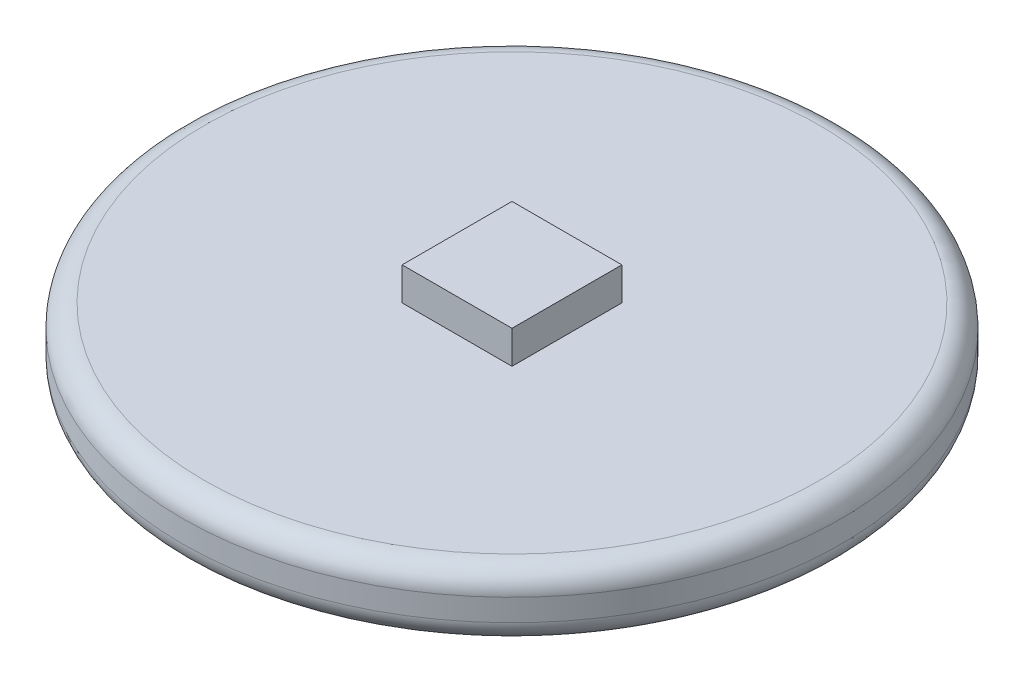
ISO-10303-21;
HEADER;
FILE_DESCRIPTION(('STEP AP214'),'2;1');
FILE_NAME('part.step','',(''),(''),'','','');
FILE_SCHEMA(('AUTOMOTIVE_DESIGN { 1 0 10303 214 1 1 1 1 }'));
ENDSEC;
DATA;
#1=APPLICATION_CONTEXT('core data for automotive mechanical design processes');
#2=APPLICATION_PROTOCOL_DEFINITION('international standard','automotive_design',2000,#1);
#3=PRODUCT_CONTEXT('',#1,'mechanical');
#4=PRODUCT('Part','Part','',(#3));
#5=PRODUCT_RELATED_PRODUCT_CATEGORY('part','',(#4));
#6=PRODUCT_DEFINITION_FORMATION('','',#4);
#7=PRODUCT_DEFINITION_CONTEXT('part definition',#1,'design');
#8=PRODUCT_DEFINITION('design','',#6,#7);
#9=PRODUCT_DEFINITION_SHAPE('','',#8);
#10=(LENGTH_UNIT() NAMED_UNIT(*) SI_UNIT(.MILLI.,.METRE.));
#11=(NAMED_UNIT(*) PLANE_ANGLE_UNIT() SI_UNIT($,.RADIAN.));
#12=(NAMED_UNIT(*) SI_UNIT($,.STERADIAN.) SOLID_ANGLE_UNIT());
#13=UNCERTAINTY_MEASURE_WITH_UNIT(LENGTH_MEASURE(1.E-05),#10,'distance_accuracy_value','');
#14=(GEOMETRIC_REPRESENTATION_CONTEXT(3) GLOBAL_UNCERTAINTY_ASSIGNED_CONTEXT((#13)) GLOBAL_UNIT_ASSIGNED_CONTEXT((#10,
#11,#12)) REPRESENTATION_CONTEXT('',''));
#15=CARTESIAN_POINT('',(0.,0.,0.));
#16=DIRECTION('',(0.,0.,1.));
#17=DIRECTION('',(1.,0.,0.));
#18=AXIS2_PLACEMENT_3D('',#15,#16,#17);
#19=CARTESIAN_POINT('',(0.,6.,0.));
#20=DIRECTION('',(0.,1.,0.));
#21=DIRECTION('',(0.,0.,1.));
#22=AXIS2_PLACEMENT_3D('',#19,#20,#21);
#23=PLANE('',#22);
#24=CARTESIAN_POINT('',(0.,6.,0.));
#25=DIRECTION('',(0.,1.,0.));
#26=DIRECTION('',(0.,0.,1.));
#27=AXIS2_PLACEMENT_3D('',#24,#25,#26);
#28=CIRCLE('',#27,28.);
#29=CARTESIAN_POINT('',(0.,6.,28.));
#30=VERTEX_POINT('',#29);
#31=EDGE_CURVE('E11',#30,#30,#28,.T.);
#32=ORIENTED_EDGE('',*,*,#31,.T.);
#33=EDGE_LOOP('',(#32));
#34=FACE_BOUND('',#33,.T.);
#35=DIRECTION('',(1.,0.,0.));
#36=VECTOR('',#35,1.);
#37=CARTESIAN_POINT('',(5.,6.,5.));
#38=LINE('',#37,#36);
#39=CARTESIAN_POINT('',(-5.,6.,5.));
#40=VERTEX_POINT('',#39);
#41=CARTESIAN_POINT('',(5.,6.,5.));
#42=VERTEX_POINT('',#41);
#43=EDGE_CURVE('E97',#40,#42,#38,.T.);
#44=ORIENTED_EDGE('',*,*,#43,.F.);
#45=DIRECTION('',(0.,0.,1.));
#46=VECTOR('',#45,1.);
#47=CARTESIAN_POINT('',(-5.,6.,5.));
#48=LINE('',#47,#46);
#49=CARTESIAN_POINT('',(-5.,6.,-5.));
#50=VERTEX_POINT('',#49);
#51=EDGE_CURVE('E111',#50,#40,#48,.T.);
#52=ORIENTED_EDGE('',*,*,#51,.F.);
#53=DIRECTION('',(-1.,0.,0.));
#54=VECTOR('',#53,1.);
#55=CARTESIAN_POINT('',(5.,6.,-5.));
#56=LINE('',#55,#54);
#57=CARTESIAN_POINT('',(5.,6.,-5.));
#58=VERTEX_POINT('',#57);
#59=EDGE_CURVE('E77',#58,#50,#56,.T.);
#60=ORIENTED_EDGE('',*,*,#59,.F.);
#61=DIRECTION('',(0.,0.,-1.));
#62=VECTOR('',#61,1.);
#63=CARTESIAN_POINT('',(5.,6.,5.));
#64=LINE('',#63,#62);
#65=EDGE_CURVE('E117',#42,#58,#64,.T.);
#66=ORIENTED_EDGE('',*,*,#65,.F.);
#67=EDGE_LOOP('',(#44,#52,#60,#66));
#68=FACE_BOUND('',#67,.T.);
#69=ADVANCED_FACE('F39',(#34,#68),#23,.T.);
#70=CARTESIAN_POINT('',(0.,6.,0.));
#71=DIRECTION('',(0.,-1.,0.));
#72=DIRECTION('',(0.,0.,-1.));
#73=AXIS2_PLACEMENT_3D('',#70,#71,#72);
#74=CYLINDRICAL_SURFACE('',#73,30.);
#75=CARTESIAN_POINT('',(0.,2.,0.));
#76=DIRECTION('',(0.,1.,0.));
#77=DIRECTION('',(0.,0.,1.));
#78=AXIS2_PLACEMENT_3D('',#75,#76,#77);
#79=CIRCLE('',#78,30.);
#80=CARTESIAN_POINT('',(0.,2.,30.));
#81=VERTEX_POINT('',#80);
#82=EDGE_CURVE('E132',#81,#81,#79,.T.);
#83=ORIENTED_EDGE('',*,*,#82,.T.);
#84=EDGE_LOOP('',(#83));
#85=FACE_BOUND('',#84,.T.);
#86=CARTESIAN_POINT('',(0.,4.,0.));
#87=DIRECTION('',(0.,1.,0.));
#88=DIRECTION('',(0.,0.,1.));
#89=AXIS2_PLACEMENT_3D('',#86,#87,#88);
#90=CIRCLE('',#89,30.);
#91=CARTESIAN_POINT('',(0.,4.,30.));
#92=VERTEX_POINT('',#91);
#93=EDGE_CURVE('E128',#92,#92,#90,.F.);
#94=ORIENTED_EDGE('',*,*,#93,.T.);
#95=EDGE_LOOP('',(#94));
#96=FACE_BOUND('',#95,.T.);
#97=ADVANCED_FACE('F146',(#85,#96),#74,.T.);
#98=CARTESIAN_POINT('',(0.,0.,0.));
#99=DIRECTION('',(0.,1.,0.));
#100=DIRECTION('',(0.,0.,1.));
#101=AXIS2_PLACEMENT_3D('',#98,#99,#100);
#102=PLANE('',#101);
#103=CARTESIAN_POINT('',(0.,0.,0.));
#104=DIRECTION('',(0.,1.,0.));
#105=DIRECTION('',(0.,0.,1.));
#106=AXIS2_PLACEMENT_3D('',#103,#104,#105);
#107=CIRCLE('',#106,28.);
#108=CARTESIAN_POINT('',(0.,0.,28.));
#109=VERTEX_POINT('',#108);
#110=EDGE_CURVE('E48',#109,#109,#107,.F.);
#111=ORIENTED_EDGE('',*,*,#110,.T.);
#112=EDGE_LOOP('',(#111));
#113=FACE_BOUND('',#112,.T.);
#114=ADVANCED_FACE('F139',(#113),#102,.F.);
#115=CARTESIAN_POINT('',(0.,2.,0.));
#116=DIRECTION('',(0.,1.,0.));
#117=DIRECTION('',(0.,0.,1.));
#118=AXIS2_PLACEMENT_3D('',#115,#116,#117);
#119=TOROIDAL_SURFACE('',#118,28.,2.);
#120=ORIENTED_EDGE('',*,*,#110,.F.);
#121=EDGE_LOOP('',(#120));
#122=FACE_BOUND('',#121,.T.);
#123=ORIENTED_EDGE('',*,*,#82,.F.);
#124=EDGE_LOOP('',(#123));
#125=FACE_BOUND('',#124,.T.);
#126=ADVANCED_FACE('F141',(#122,#125),#119,.T.);
#127=CARTESIAN_POINT('',(0.,4.,0.));
#128=DIRECTION('',(0.,1.,0.));
#129=DIRECTION('',(0.,0.,1.));
#130=AXIS2_PLACEMENT_3D('',#127,#128,#129);
#131=TOROIDAL_SURFACE('',#130,28.,2.);
#132=ORIENTED_EDGE('',*,*,#93,.F.);
#133=EDGE_LOOP('',(#132));
#134=FACE_BOUND('',#133,.T.);
#135=ORIENTED_EDGE('',*,*,#31,.F.);
#136=EDGE_LOOP('',(#135));
#137=FACE_BOUND('',#136,.T.);
#138=ADVANCED_FACE('F41',(#134,#137),#131,.T.);
#139=CARTESIAN_POINT('',(-5.,9.,5.));
#140=DIRECTION('',(1.,0.,0.));
#141=DIRECTION('',(0.,0.,-1.));
#142=AXIS2_PLACEMENT_3D('',#139,#140,#141);
#143=PLANE('',#142);
#144=ORIENTED_EDGE('',*,*,#51,.T.);
#145=DIRECTION('',(0.,-1.,0.));
#146=VECTOR('',#145,1.);
#147=CARTESIAN_POINT('',(-5.,9.,5.));
#148=LINE('',#147,#146);
#149=CARTESIAN_POINT('',(-5.,9.,5.));
#150=VERTEX_POINT('',#149);
#151=EDGE_CURVE('E101',#150,#40,#148,.T.);
#152=ORIENTED_EDGE('',*,*,#151,.F.);
#153=DIRECTION('',(0.,0.,1.));
#154=VECTOR('',#153,1.);
#155=CARTESIAN_POINT('',(-5.,9.,5.));
#156=LINE('',#155,#154);
#157=CARTESIAN_POINT('',(-5.,9.,-5.));
#158=VERTEX_POINT('',#157);
#159=EDGE_CURVE('E89',#158,#150,#156,.T.);
#160=ORIENTED_EDGE('',*,*,#159,.F.);
#161=DIRECTION('',(0.,-1.,0.));
#162=VECTOR('',#161,1.);
#163=CARTESIAN_POINT('',(-5.,9.,-5.));
#164=LINE('',#163,#162);
#165=EDGE_CURVE('E107',#158,#50,#164,.T.);
#166=ORIENTED_EDGE('',*,*,#165,.T.);
#167=EDGE_LOOP('',(#144,#152,#160,#166));
#168=FACE_BOUND('',#167,.T.);
#169=ADVANCED_FACE('F154',(#168),#143,.F.);
#170=CARTESIAN_POINT('',(5.,9.,5.));
#171=DIRECTION('',(0.,0.,-1.));
#172=DIRECTION('',(-1.,0.,0.));
#173=AXIS2_PLACEMENT_3D('',#170,#171,#172);
#174=PLANE('',#173);
#175=ORIENTED_EDGE('',*,*,#43,.T.);
#176=DIRECTION('',(0.,-1.,0.));
#177=VECTOR('',#176,1.);
#178=CARTESIAN_POINT('',(5.,9.,5.));
#179=LINE('',#178,#177);
#180=CARTESIAN_POINT('',(5.,9.,5.));
#181=VERTEX_POINT('',#180);
#182=EDGE_CURVE('E94',#181,#42,#179,.T.);
#183=ORIENTED_EDGE('',*,*,#182,.F.);
#184=DIRECTION('',(1.,0.,0.));
#185=VECTOR('',#184,1.);
#186=CARTESIAN_POINT('',(5.,9.,5.));
#187=LINE('',#186,#185);
#188=EDGE_CURVE('E84',#150,#181,#187,.T.);
#189=ORIENTED_EDGE('',*,*,#188,.F.);
#190=ORIENTED_EDGE('',*,*,#151,.T.);
#191=EDGE_LOOP('',(#175,#183,#189,#190));
#192=FACE_BOUND('',#191,.T.);
#193=ADVANCED_FACE('F95',(#192),#174,.F.);
#194=CARTESIAN_POINT('',(5.,9.,5.));
#195=DIRECTION('',(-1.,0.,0.));
#196=DIRECTION('',(0.,0.,1.));
#197=AXIS2_PLACEMENT_3D('',#194,#195,#196);
#198=PLANE('',#197);
#199=ORIENTED_EDGE('',*,*,#65,.T.);
#200=DIRECTION('',(0.,-1.,0.));
#201=VECTOR('',#200,1.);
#202=CARTESIAN_POINT('',(5.,9.,-5.));
#203=LINE('',#202,#201);
#204=CARTESIAN_POINT('',(5.,9.,-5.));
#205=VERTEX_POINT('',#204);
#206=EDGE_CURVE('E55',#205,#58,#203,.T.);
#207=ORIENTED_EDGE('',*,*,#206,.F.);
#208=DIRECTION('',(0.,0.,-1.));
#209=VECTOR('',#208,1.);
#210=CARTESIAN_POINT('',(5.,9.,5.));
#211=LINE('',#210,#209);
#212=EDGE_CURVE('E87',#181,#205,#211,.T.);
#213=ORIENTED_EDGE('',*,*,#212,.F.);
#214=ORIENTED_EDGE('',*,*,#182,.T.);
#215=EDGE_LOOP('',(#199,#207,#213,#214));
#216=FACE_BOUND('',#215,.T.);
#217=ADVANCED_FACE('F103',(#216),#198,.F.);
#218=CARTESIAN_POINT('',(5.,9.,-5.));
#219=DIRECTION('',(0.,0.,1.));
#220=DIRECTION('',(1.,0.,0.));
#221=AXIS2_PLACEMENT_3D('',#218,#219,#220);
#222=PLANE('',#221);
#223=ORIENTED_EDGE('',*,*,#59,.T.);
#224=ORIENTED_EDGE('',*,*,#165,.F.);
#225=DIRECTION('',(-1.,0.,0.));
#226=VECTOR('',#225,1.);
#227=CARTESIAN_POINT('',(5.,9.,-5.));
#228=LINE('',#227,#226);
#229=EDGE_CURVE('E63',#205,#158,#228,.T.);
#230=ORIENTED_EDGE('',*,*,#229,.F.);
#231=ORIENTED_EDGE('',*,*,#206,.T.);
#232=EDGE_LOOP('',(#223,#224,#230,#231));
#233=FACE_BOUND('',#232,.T.);
#234=ADVANCED_FACE('F162',(#233),#222,.F.);
#235=CARTESIAN_POINT('',(0.,9.,0.));
#236=DIRECTION('',(0.,1.,0.));
#237=DIRECTION('',(0.,0.,1.));
#238=AXIS2_PLACEMENT_3D('',#235,#236,#237);
#239=PLANE('',#238);
#240=ORIENTED_EDGE('',*,*,#159,.T.);
#241=ORIENTED_EDGE('',*,*,#188,.T.);
#242=ORIENTED_EDGE('',*,*,#212,.T.);
#243=ORIENTED_EDGE('',*,*,#229,.T.);
#244=EDGE_LOOP('',(#240,#241,#242,#243));
#245=FACE_BOUND('',#244,.T.);
#246=ADVANCED_FACE('F85',(#245),#239,.T.);
#247=CLOSED_SHELL('',(#69,#97,#114,#126,#138,#169,#193,#217,#234,#246));
#248=MANIFOLD_SOLID_BREP('B2',#247);
#249=ADVANCED_BREP_SHAPE_REPRESENTATION('',(#18,#248),#14);
#250=SHAPE_DEFINITION_REPRESENTATION(#9,#249);
ENDSEC;
END-ISO-10303-21;
